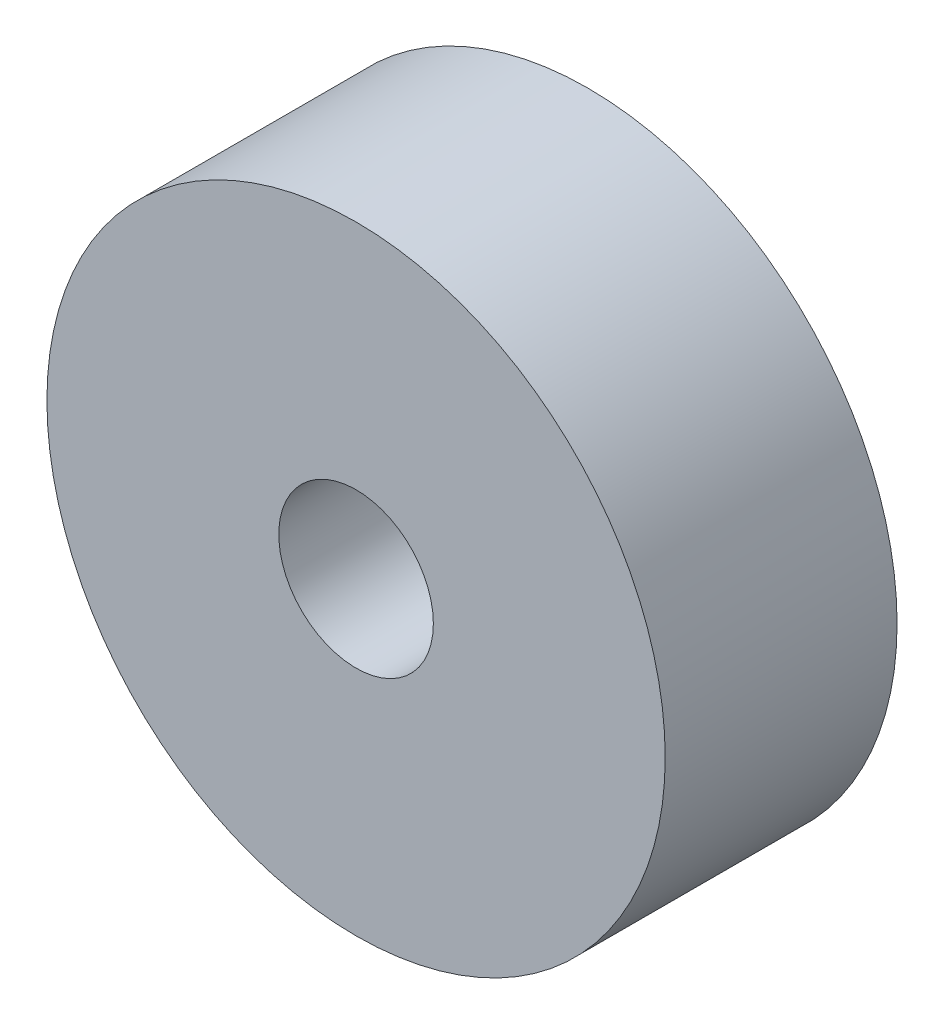
ISO-10303-21;
HEADER;
FILE_DESCRIPTION(('STEP AP214'),'2;1');
FILE_NAME('part.step','',(''),(''),'','','');
FILE_SCHEMA(('AUTOMOTIVE_DESIGN { 1 0 10303 214 1 1 1 1 }'));
ENDSEC;
DATA;
#1=APPLICATION_CONTEXT('core data for automotive mechanical design processes');
#2=APPLICATION_PROTOCOL_DEFINITION('international standard','automotive_design',2000,#1);
#3=PRODUCT_CONTEXT('',#1,'mechanical');
#4=PRODUCT('Part','Part','',(#3));
#5=PRODUCT_RELATED_PRODUCT_CATEGORY('part','',(#4));
#6=PRODUCT_DEFINITION_FORMATION('','',#4);
#7=PRODUCT_DEFINITION_CONTEXT('part definition',#1,'design');
#8=PRODUCT_DEFINITION('design','',#6,#7);
#9=PRODUCT_DEFINITION_SHAPE('','',#8);
#10=(LENGTH_UNIT() NAMED_UNIT(*) SI_UNIT(.MILLI.,.METRE.));
#11=(NAMED_UNIT(*) PLANE_ANGLE_UNIT() SI_UNIT($,.RADIAN.));
#12=(NAMED_UNIT(*) SI_UNIT($,.STERADIAN.) SOLID_ANGLE_UNIT());
#13=UNCERTAINTY_MEASURE_WITH_UNIT(LENGTH_MEASURE(1.E-05),#10,'distance_accuracy_value','');
#14=(GEOMETRIC_REPRESENTATION_CONTEXT(3) GLOBAL_UNCERTAINTY_ASSIGNED_CONTEXT((#13)) GLOBAL_UNIT_ASSIGNED_CONTEXT((#10,
#11,#12)) REPRESENTATION_CONTEXT('',''));
#15=CARTESIAN_POINT('',(0.,0.,0.));
#16=DIRECTION('',(0.,0.,1.));
#17=DIRECTION('',(1.,0.,0.));
#18=AXIS2_PLACEMENT_3D('',#15,#16,#17);
#19=CARTESIAN_POINT('',(0.,0.,-76.2));
#20=DIRECTION('',(0.,0.,1.));
#21=DIRECTION('',(1.,0.,0.));
#22=AXIS2_PLACEMENT_3D('',#19,#20,#21);
#23=CYLINDRICAL_SURFACE('',#22,101.6);
#24=CARTESIAN_POINT('',(0.,0.,-76.2));
#25=DIRECTION('',(0.,0.,1.));
#26=DIRECTION('',(1.,0.,0.));
#27=AXIS2_PLACEMENT_3D('',#24,#25,#26);
#28=CIRCLE('',#27,101.6);
#29=CARTESIAN_POINT('',(101.6,0.,-76.2));
#30=VERTEX_POINT('',#29);
#31=EDGE_CURVE('E10',#30,#30,#28,.T.);
#32=CARTESIAN_POINT('',(0.,0.,0.));
#33=DIRECTION('',(0.,0.,1.));
#34=DIRECTION('',(1.,0.,0.));
#35=AXIS2_PLACEMENT_3D('',#32,#33,#34);
#36=CIRCLE('',#35,101.6);
#37=CARTESIAN_POINT('',(101.6,0.,0.));
#38=VERTEX_POINT('',#37);
#39=EDGE_CURVE('E35',#38,#38,#36,.T.);
#40=CARTESIAN_POINT('',(101.6,0.,-76.2));
#41=CARTESIAN_POINT('',(101.6,0.,-75.40625));
#42=CARTESIAN_POINT('',(101.6,0.,-74.6125));
#43=CARTESIAN_POINT('',(101.6,0.,-73.025));
#44=CARTESIAN_POINT('',(101.6,0.,-72.23125));
#45=CARTESIAN_POINT('',(101.6,0.,-70.64375));
#46=CARTESIAN_POINT('',(101.6,0.,-69.85));
#47=CARTESIAN_POINT('',(101.6,0.,-68.2625));
#48=CARTESIAN_POINT('',(101.6,0.,-67.46875));
#49=CARTESIAN_POINT('',(101.6,0.,-65.88125));
#50=CARTESIAN_POINT('',(101.6,0.,-65.0875));
#51=CARTESIAN_POINT('',(101.6,0.,-63.5));
#52=CARTESIAN_POINT('',(101.6,0.,-62.70625));
#53=CARTESIAN_POINT('',(101.6,0.,-61.11875));
#54=CARTESIAN_POINT('',(101.6,0.,-60.325));
#55=CARTESIAN_POINT('',(101.6,0.,-58.7375));
#56=CARTESIAN_POINT('',(101.6,0.,-57.94375));
#57=CARTESIAN_POINT('',(101.6,0.,-56.35625));
#58=CARTESIAN_POINT('',(101.6,0.,-55.5625));
#59=CARTESIAN_POINT('',(101.6,0.,-53.975));
#60=CARTESIAN_POINT('',(101.6,0.,-53.18125));
#61=CARTESIAN_POINT('',(101.6,0.,-51.59375));
#62=CARTESIAN_POINT('',(101.6,0.,-50.8));
#63=CARTESIAN_POINT('',(101.6,0.,-49.2125));
#64=CARTESIAN_POINT('',(101.6,0.,-48.41875));
#65=CARTESIAN_POINT('',(101.6,0.,-46.83125));
#66=CARTESIAN_POINT('',(101.6,0.,-46.0375));
#67=CARTESIAN_POINT('',(101.6,0.,-44.45));
#68=CARTESIAN_POINT('',(101.6,0.,-43.65625));
#69=CARTESIAN_POINT('',(101.6,0.,-42.06875));
#70=CARTESIAN_POINT('',(101.6,0.,-41.275));
#71=CARTESIAN_POINT('',(101.6,0.,-39.6875));
#72=CARTESIAN_POINT('',(101.6,0.,-38.89375));
#73=CARTESIAN_POINT('',(101.6,0.,-37.30625));
#74=CARTESIAN_POINT('',(101.6,0.,-36.5125));
#75=CARTESIAN_POINT('',(101.6,0.,-34.925));
#76=CARTESIAN_POINT('',(101.6,0.,-34.13125));
#77=CARTESIAN_POINT('',(101.6,0.,-32.54375));
#78=CARTESIAN_POINT('',(101.6,0.,-31.75));
#79=CARTESIAN_POINT('',(101.6,0.,-30.1625));
#80=CARTESIAN_POINT('',(101.6,0.,-29.36875));
#81=CARTESIAN_POINT('',(101.6,0.,-27.78125));
#82=CARTESIAN_POINT('',(101.6,0.,-26.9875));
#83=CARTESIAN_POINT('',(101.6,0.,-25.4));
#84=CARTESIAN_POINT('',(101.6,0.,-24.60625));
#85=CARTESIAN_POINT('',(101.6,0.,-23.01875));
#86=CARTESIAN_POINT('',(101.6,0.,-22.225));
#87=CARTESIAN_POINT('',(101.6,0.,-20.6375));
#88=CARTESIAN_POINT('',(101.6,0.,-19.84375));
#89=CARTESIAN_POINT('',(101.6,0.,-18.25625));
#90=CARTESIAN_POINT('',(101.6,0.,-17.4625));
#91=CARTESIAN_POINT('',(101.6,0.,-15.875));
#92=CARTESIAN_POINT('',(101.6,0.,-15.08125));
#93=CARTESIAN_POINT('',(101.6,0.,-13.49375));
#94=CARTESIAN_POINT('',(101.6,0.,-12.7));
#95=CARTESIAN_POINT('',(101.6,0.,-11.1125));
#96=CARTESIAN_POINT('',(101.6,0.,-10.31875));
#97=CARTESIAN_POINT('',(101.6,0.,-8.73125));
#98=CARTESIAN_POINT('',(101.6,0.,-7.93750000000001));
#99=CARTESIAN_POINT('',(101.6,0.,-6.35));
#100=CARTESIAN_POINT('',(101.6,0.,-5.55625));
#101=CARTESIAN_POINT('',(101.6,0.,-3.96875));
#102=CARTESIAN_POINT('',(101.6,0.,-3.175));
#103=CARTESIAN_POINT('',(101.6,0.,-1.5875));
#104=CARTESIAN_POINT('',(101.6,0.,-0.793750000000001));
#105=CARTESIAN_POINT('',(101.6,0.,0.));
#106=B_SPLINE_CURVE_WITH_KNOTS('',3,(#40,#41,#42,#43,#44,#45,#46,#47,#48,#49,#50,#51,#52,#53,
#54,#55,#56,#57,#58,#59,#60,#61,#62,#63,#64,#65,#66,#67,#68,#69,#70,#71,#72,#73,#74,#75,#76,#77,
#78,#79,#80,#81,#82,#83,#84,#85,#86,#87,#88,#89,#90,#91,#92,#93,#94,#95,#96,#97,#98,#99,#100,
#101,#102,#103,#104,#105),.UNSPECIFIED.,.F.,.F.,(4,2,2,2,2,2,2,2,2,2,2,2,2,2,2,2,2,2,2,2,2,2,2,
2,2,2,2,2,2,2,2,2,4),(0.,2.38124999999999,4.76249999999999,7.14374999999999,9.52499999999999,
11.90625,14.2875,16.66875,19.05,21.43125,23.8125,26.19375,28.575,30.95625,33.3375,35.71875,38.1,
40.48125,42.8625,45.24375,47.625,50.00625,52.3875,54.76875,57.15,59.53125,61.9125,64.29375,
66.675,69.05625,71.4375,73.81875,76.2),.UNSPECIFIED.);
#107=EDGE_CURVE('BSEAM32',#30,#38,#106,.T.);
#108=ORIENTED_EDGE('',*,*,#31,.T.);
#109=ORIENTED_EDGE('',*,*,#39,.F.);
#110=ORIENTED_EDGE('',*,*,#107,.T.);
#111=ORIENTED_EDGE('',*,*,#107,.F.);
#112=EDGE_LOOP('',(#108,#110,#109,#111));
#113=FACE_BOUND('',#112,.T.);
#114=ADVANCED_FACE('F32',(#113),#23,.T.);
#115=CARTESIAN_POINT('',(0.,0.,-76.2));
#116=DIRECTION('',(0.,0.,1.));
#117=DIRECTION('',(1.,0.,0.));
#118=AXIS2_PLACEMENT_3D('',#115,#116,#117);
#119=PLANE('',#118);
#120=CARTESIAN_POINT('',(0.,0.,-76.2));
#121=DIRECTION('',(0.,0.,1.));
#122=DIRECTION('',(1.,0.,0.));
#123=AXIS2_PLACEMENT_3D('',#120,#121,#122);
#124=CIRCLE('',#123,25.4);
#125=CARTESIAN_POINT('',(25.4,0.,-76.2));
#126=VERTEX_POINT('',#125);
#127=EDGE_CURVE('E42',#126,#126,#124,.T.);
#128=ORIENTED_EDGE('',*,*,#127,.T.);
#129=EDGE_LOOP('',(#128));
#130=FACE_BOUND('',#129,.T.);
#131=ORIENTED_EDGE('',*,*,#31,.F.);
#132=EDGE_LOOP('',(#131));
#133=FACE_BOUND('',#132,.T.);
#134=ADVANCED_FACE('F50',(#130,#133),#119,.F.);
#135=CARTESIAN_POINT('',(0.,0.,0.));
#136=DIRECTION('',(0.,0.,1.));
#137=DIRECTION('',(1.,0.,0.));
#138=AXIS2_PLACEMENT_3D('',#135,#136,#137);
#139=PLANE('',#138);
#140=CARTESIAN_POINT('',(0.,0.,0.));
#141=DIRECTION('',(0.,0.,1.));
#142=DIRECTION('',(1.,0.,0.));
#143=AXIS2_PLACEMENT_3D('',#140,#141,#142);
#144=CIRCLE('',#143,25.4);
#145=CARTESIAN_POINT('',(25.4,0.,0.));
#146=VERTEX_POINT('',#145);
#147=EDGE_CURVE('E44',#146,#146,#144,.T.);
#148=ORIENTED_EDGE('',*,*,#147,.F.);
#149=EDGE_LOOP('',(#148));
#150=FACE_BOUND('',#149,.T.);
#151=ORIENTED_EDGE('',*,*,#39,.T.);
#152=EDGE_LOOP('',(#151));
#153=FACE_BOUND('',#152,.T.);
#154=ADVANCED_FACE('F56',(#150,#153),#139,.T.);
#155=CARTESIAN_POINT('',(0.,0.,-76.2));
#156=DIRECTION('',(0.,0.,1.));
#157=DIRECTION('',(1.,0.,0.));
#158=AXIS2_PLACEMENT_3D('',#155,#156,#157);
#159=CYLINDRICAL_SURFACE('',#158,25.4);
#160=CARTESIAN_POINT('',(25.4,0.,-76.2));
#161=CARTESIAN_POINT('',(25.4,0.,-75.40625));
#162=CARTESIAN_POINT('',(25.4,0.,-74.6125));
#163=CARTESIAN_POINT('',(25.4,0.,-73.025));
#164=CARTESIAN_POINT('',(25.4,0.,-72.23125));
#165=CARTESIAN_POINT('',(25.4,0.,-70.64375));
#166=CARTESIAN_POINT('',(25.4,0.,-69.85));
#167=CARTESIAN_POINT('',(25.4,0.,-68.2625));
#168=CARTESIAN_POINT('',(25.4,0.,-67.46875));
#169=CARTESIAN_POINT('',(25.4,0.,-65.88125));
#170=CARTESIAN_POINT('',(25.4,0.,-65.0875));
#171=CARTESIAN_POINT('',(25.4,0.,-63.5));
#172=CARTESIAN_POINT('',(25.4,0.,-62.70625));
#173=CARTESIAN_POINT('',(25.4,0.,-61.11875));
#174=CARTESIAN_POINT('',(25.4,0.,-60.325));
#175=CARTESIAN_POINT('',(25.4,0.,-58.7375));
#176=CARTESIAN_POINT('',(25.4,0.,-57.94375));
#177=CARTESIAN_POINT('',(25.4,0.,-56.35625));
#178=CARTESIAN_POINT('',(25.4,0.,-55.5625));
#179=CARTESIAN_POINT('',(25.4,0.,-53.975));
#180=CARTESIAN_POINT('',(25.4,0.,-53.18125));
#181=CARTESIAN_POINT('',(25.4,0.,-51.59375));
#182=CARTESIAN_POINT('',(25.4,0.,-50.8));
#183=CARTESIAN_POINT('',(25.4,0.,-49.2125));
#184=CARTESIAN_POINT('',(25.4,0.,-48.41875));
#185=CARTESIAN_POINT('',(25.4,0.,-46.83125));
#186=CARTESIAN_POINT('',(25.4,0.,-46.0375));
#187=CARTESIAN_POINT('',(25.4,0.,-44.45));
#188=CARTESIAN_POINT('',(25.4,0.,-43.65625));
#189=CARTESIAN_POINT('',(25.4,0.,-42.06875));
#190=CARTESIAN_POINT('',(25.4,0.,-41.275));
#191=CARTESIAN_POINT('',(25.4,0.,-39.6875));
#192=CARTESIAN_POINT('',(25.4,0.,-38.89375));
#193=CARTESIAN_POINT('',(25.4,0.,-37.30625));
#194=CARTESIAN_POINT('',(25.4,0.,-36.5125));
#195=CARTESIAN_POINT('',(25.4,0.,-34.925));
#196=CARTESIAN_POINT('',(25.4,0.,-34.13125));
#197=CARTESIAN_POINT('',(25.4,0.,-32.54375));
#198=CARTESIAN_POINT('',(25.4,0.,-31.75));
#199=CARTESIAN_POINT('',(25.4,0.,-30.1625));
#200=CARTESIAN_POINT('',(25.4,0.,-29.36875));
#201=CARTESIAN_POINT('',(25.4,0.,-27.78125));
#202=CARTESIAN_POINT('',(25.4,0.,-26.9875));
#203=CARTESIAN_POINT('',(25.4,0.,-25.4));
#204=CARTESIAN_POINT('',(25.4,0.,-24.60625));
#205=CARTESIAN_POINT('',(25.4,0.,-23.01875));
#206=CARTESIAN_POINT('',(25.4,0.,-22.225));
#207=CARTESIAN_POINT('',(25.4,0.,-20.6375));
#208=CARTESIAN_POINT('',(25.4,0.,-19.84375));
#209=CARTESIAN_POINT('',(25.4,0.,-18.25625));
#210=CARTESIAN_POINT('',(25.4,0.,-17.4625));
#211=CARTESIAN_POINT('',(25.4,0.,-15.875));
#212=CARTESIAN_POINT('',(25.4,0.,-15.08125));
#213=CARTESIAN_POINT('',(25.4,0.,-13.49375));
#214=CARTESIAN_POINT('',(25.4,0.,-12.7));
#215=CARTESIAN_POINT('',(25.4,0.,-11.1125));
#216=CARTESIAN_POINT('',(25.4,0.,-10.31875));
#217=CARTESIAN_POINT('',(25.4,0.,-8.73125));
#218=CARTESIAN_POINT('',(25.4,0.,-7.93750000000001));
#219=CARTESIAN_POINT('',(25.4,0.,-6.35));
#220=CARTESIAN_POINT('',(25.4,0.,-5.55625));
#221=CARTESIAN_POINT('',(25.4,0.,-3.96875));
#222=CARTESIAN_POINT('',(25.4,0.,-3.175));
#223=CARTESIAN_POINT('',(25.4,0.,-1.5875));
#224=CARTESIAN_POINT('',(25.4,0.,-0.793750000000001));
#225=CARTESIAN_POINT('',(25.4,0.,0.));
#226=B_SPLINE_CURVE_WITH_KNOTS('',3,(#160,#161,#162,#163,#164,#165,#166,#167,#168,#169,#170,
#171,#172,#173,#174,#175,#176,#177,#178,#179,#180,#181,#182,#183,#184,#185,#186,#187,#188,#189,
#190,#191,#192,#193,#194,#195,#196,#197,#198,#199,#200,#201,#202,#203,#204,#205,#206,#207,#208,
#209,#210,#211,#212,#213,#214,#215,#216,#217,#218,#219,#220,#221,#222,#223,#224,#225),
.UNSPECIFIED.,.F.,.F.,(4,2,2,2,2,2,2,2,2,2,2,2,2,2,2,2,2,2,2,2,2,2,2,2,2,2,2,2,2,2,2,2,4),(0.,
2.38124999999999,4.76249999999999,7.14374999999999,9.52499999999999,11.90625,14.2875,16.66875,
19.05,21.43125,23.8125,26.19375,28.575,30.95625,33.3375,35.71875,38.1,40.48125,42.8625,45.24375,
47.625,50.00625,52.3875,54.76875,57.15,59.53125,61.9125,64.29375,66.675,69.05625,71.4375,
73.81875,76.2),.UNSPECIFIED.);
#227=EDGE_CURVE('BSEAM53',#126,#146,#226,.T.);
#228=ORIENTED_EDGE('',*,*,#127,.F.);
#229=ORIENTED_EDGE('',*,*,#147,.T.);
#230=ORIENTED_EDGE('',*,*,#227,.T.);
#231=ORIENTED_EDGE('',*,*,#227,.F.);
#232=EDGE_LOOP('',(#228,#230,#229,#231));
#233=FACE_BOUND('',#232,.T.);
#234=ADVANCED_FACE('F53',(#233),#159,.F.);
#235=CLOSED_SHELL('',(#114,#134,#154,#234));
#236=MANIFOLD_SOLID_BREP('B2',#235);
#237=ADVANCED_BREP_SHAPE_REPRESENTATION('',(#18,#236),#14);
#238=SHAPE_DEFINITION_REPRESENTATION(#9,#237);
ENDSEC;
END-ISO-10303-21;
